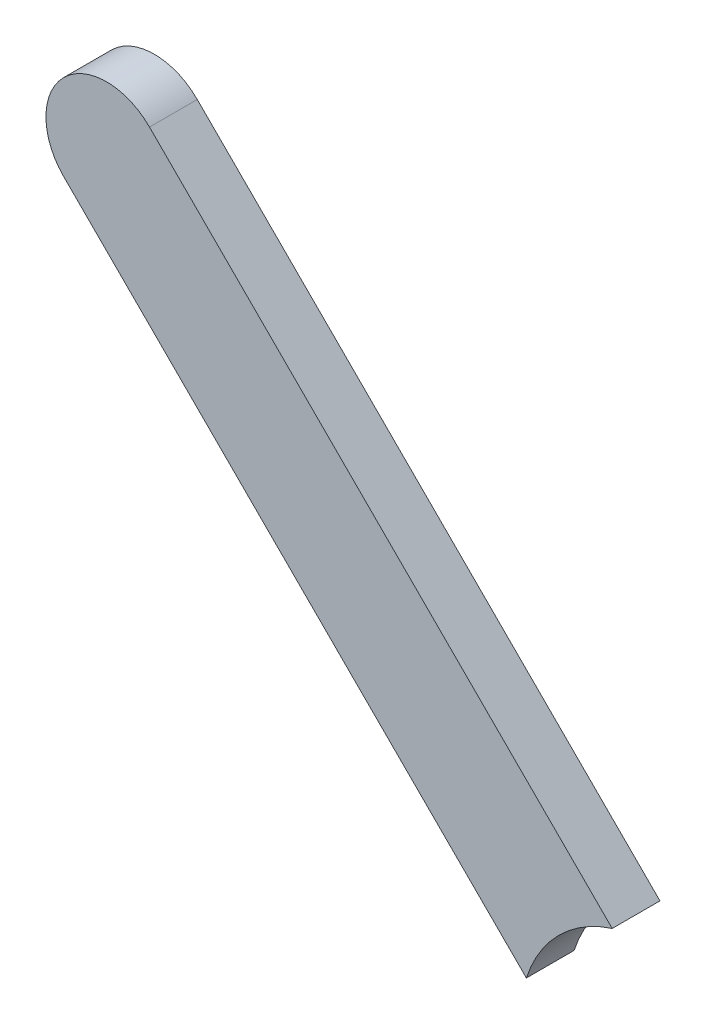
ISO-10303-21;
HEADER;
FILE_DESCRIPTION(('STEP AP214'),'2;1');
FILE_NAME('part.step','',(''),(''),'','','');
FILE_SCHEMA(('AUTOMOTIVE_DESIGN { 1 0 10303 214 1 1 1 1 }'));
ENDSEC;
DATA;
#1=APPLICATION_CONTEXT('core data for automotive mechanical design processes');
#2=APPLICATION_PROTOCOL_DEFINITION('international standard','automotive_design',2000,#1);
#3=PRODUCT_CONTEXT('',#1,'mechanical');
#4=PRODUCT('Part','Part','',(#3));
#5=PRODUCT_RELATED_PRODUCT_CATEGORY('part','',(#4));
#6=PRODUCT_DEFINITION_FORMATION('','',#4);
#7=PRODUCT_DEFINITION_CONTEXT('part definition',#1,'design');
#8=PRODUCT_DEFINITION('design','',#6,#7);
#9=PRODUCT_DEFINITION_SHAPE('','',#8);
#10=(LENGTH_UNIT() NAMED_UNIT(*) SI_UNIT(.MILLI.,.METRE.));
#11=(NAMED_UNIT(*) PLANE_ANGLE_UNIT() SI_UNIT($,.RADIAN.));
#12=(NAMED_UNIT(*) SI_UNIT($,.STERADIAN.) SOLID_ANGLE_UNIT());
#13=UNCERTAINTY_MEASURE_WITH_UNIT(LENGTH_MEASURE(1.E-05),#10,'distance_accuracy_value','');
#14=(GEOMETRIC_REPRESENTATION_CONTEXT(3) GLOBAL_UNCERTAINTY_ASSIGNED_CONTEXT((#13)) GLOBAL_UNIT_ASSIGNED_CONTEXT((#10,
#11,#12)) REPRESENTATION_CONTEXT('',''));
#15=CARTESIAN_POINT('',(0.,0.,0.));
#16=DIRECTION('',(0.,0.,1.));
#17=DIRECTION('',(1.,0.,0.));
#18=AXIS2_PLACEMENT_3D('',#15,#16,#17);
#19=CARTESIAN_POINT('',(91.38739406,87.95539686,0.));
#20=DIRECTION('',(0.707106781186548,0.707106781186548,0.));
#21=DIRECTION('',(0.707106781186548,-0.707106781186548,0.));
#22=AXIS2_PLACEMENT_3D('',#19,#20,#21);
#23=PLANE('',#22);
#24=DIRECTION('',(0.707106781186548,-0.707106781186548,0.));
#25=VECTOR('',#24,1.);
#26=CARTESIAN_POINT('',(91.38739406,87.95539686,0.1999996));
#27=LINE('',#26,#25);
#28=CARTESIAN_POINT('',(91.38739406,87.95539686,0.1999996));
#29=VERTEX_POINT('',#28);
#30=CARTESIAN_POINT('',(93.3244609788559,86.0183299411441,0.1999996));
#31=VERTEX_POINT('',#30);
#32=EDGE_CURVE('E11',#29,#31,#27,.T.);
#33=ORIENTED_EDGE('',*,*,#32,.F.);
#34=DIRECTION('',(0.,0.,1.));
#35=VECTOR('',#34,1.);
#36=CARTESIAN_POINT('',(91.38739406,87.95539686,0.));
#37=LINE('',#36,#35);
#38=CARTESIAN_POINT('',(91.38739406,87.95539686,0.));
#39=VERTEX_POINT('',#38);
#40=EDGE_CURVE('E24',#39,#29,#37,.T.);
#41=ORIENTED_EDGE('',*,*,#40,.F.);
#42=DIRECTION('',(0.707106781186548,-0.707106781186548,0.));
#43=VECTOR('',#42,1.);
#44=CARTESIAN_POINT('',(91.38739406,87.95539686,0.));
#45=LINE('',#44,#43);
#46=CARTESIAN_POINT('',(93.3244609788559,86.0183299411441,0.));
#47=VERTEX_POINT('',#46);
#48=EDGE_CURVE('E75',#39,#47,#45,.T.);
#49=ORIENTED_EDGE('',*,*,#48,.T.);
#50=DIRECTION('',(0.,0.,1.));
#51=VECTOR('',#50,1.);
#52=CARTESIAN_POINT('',(93.3244609788559,86.0183299411441,0.));
#53=LINE('',#52,#51);
#54=EDGE_CURVE('E37',#47,#31,#53,.T.);
#55=ORIENTED_EDGE('',*,*,#54,.T.);
#56=EDGE_LOOP('',(#33,#41,#49,#55));
#57=FACE_BOUND('',#56,.T.);
#58=ADVANCED_FACE('F17',(#57),#23,.F.);
#59=CARTESIAN_POINT('',(93.853,85.8490028,0.));
#60=DIRECTION('',(0.,0.,-1.));
#61=DIRECTION('',(1.,0.,0.));
#62=AXIS2_PLACEMENT_3D('',#59,#60,#61);
#63=CYLINDRICAL_SURFACE('',#62,0.55500016);
#64=DIRECTION('',(0.,0.,1.));
#65=VECTOR('',#64,1.);
#66=CARTESIAN_POINT('',(93.6836728588559,86.3775418211441,0.));
#67=LINE('',#66,#65);
#68=CARTESIAN_POINT('',(93.6836728588559,86.3775418211441,0.));
#69=VERTEX_POINT('',#68);
#70=CARTESIAN_POINT('',(93.6836728588559,86.3775418211441,0.1999996));
#71=VERTEX_POINT('',#70);
#72=EDGE_CURVE('E67',#69,#71,#67,.T.);
#73=ORIENTED_EDGE('',*,*,#72,.T.);
#74=CARTESIAN_POINT('',(93.853,85.8490028,0.1999996));
#75=DIRECTION('',(0.,0.,1.));
#76=DIRECTION('',(1.,0.,0.));
#77=AXIS2_PLACEMENT_3D('',#74,#75,#76);
#78=CIRCLE('',#77,0.55500016);
#79=EDGE_CURVE('E82',#71,#31,#78,.T.);
#80=ORIENTED_EDGE('',*,*,#79,.T.);
#81=ORIENTED_EDGE('',*,*,#54,.F.);
#82=CARTESIAN_POINT('',(93.853,85.8490028,0.));
#83=DIRECTION('',(0.,0.,1.));
#84=DIRECTION('',(1.,0.,0.));
#85=AXIS2_PLACEMENT_3D('',#82,#83,#84);
#86=CIRCLE('',#85,0.55500016);
#87=EDGE_CURVE('E80',#69,#47,#86,.T.);
#88=ORIENTED_EDGE('',*,*,#87,.F.);
#89=EDGE_LOOP('',(#73,#80,#81,#88));
#90=FACE_BOUND('',#89,.T.);
#91=ADVANCED_FACE('F88',(#90),#63,.F.);
#92=CARTESIAN_POINT('',(93.6836728588559,86.3775418211441,0.));
#93=DIRECTION('',(-0.707106781186548,-0.707106781186548,0.));
#94=DIRECTION('',(-0.707106781186548,0.707106781186548,0.));
#95=AXIS2_PLACEMENT_3D('',#92,#93,#94);
#96=PLANE('',#95);
#97=DIRECTION('',(-0.707106781186548,0.707106781186548,0.));
#98=VECTOR('',#97,1.);
#99=CARTESIAN_POINT('',(94.03260594,86.02860874,0.1999996));
#100=LINE('',#99,#98);
#101=CARTESIAN_POINT('',(91.74660594,88.31460874,0.1999996));
#102=VERTEX_POINT('',#101);
#103=EDGE_CURVE('E71',#71,#102,#100,.T.);
#104=ORIENTED_EDGE('',*,*,#103,.F.);
#105=ORIENTED_EDGE('',*,*,#72,.F.);
#106=DIRECTION('',(-0.707106781186548,0.707106781186548,0.));
#107=VECTOR('',#106,1.);
#108=CARTESIAN_POINT('',(94.03260594,86.02860874,0.));
#109=LINE('',#108,#107);
#110=CARTESIAN_POINT('',(91.74660594,88.31460874,0.));
#111=VERTEX_POINT('',#110);
#112=EDGE_CURVE('E63',#69,#111,#109,.T.);
#113=ORIENTED_EDGE('',*,*,#112,.T.);
#114=DIRECTION('',(0.,0.,1.));
#115=VECTOR('',#114,1.);
#116=CARTESIAN_POINT('',(91.74660594,88.31460874,0.));
#117=LINE('',#116,#115);
#118=EDGE_CURVE('E53',#111,#102,#117,.T.);
#119=ORIENTED_EDGE('',*,*,#118,.T.);
#120=EDGE_LOOP('',(#104,#105,#113,#119));
#121=FACE_BOUND('',#120,.T.);
#122=ADVANCED_FACE('F66',(#121),#96,.F.);
#123=CARTESIAN_POINT('',(91.567,88.1350028,0.));
#124=DIRECTION('',(0.,0.,-1.));
#125=DIRECTION('',(0.707106781186548,0.707106781186548,0.));
#126=AXIS2_PLACEMENT_3D('',#123,#124,#125);
#127=CYLINDRICAL_SURFACE('',#126,0.254001156230768);
#128=CARTESIAN_POINT('',(91.567,88.1350028,0.1999996));
#129=DIRECTION('',(0.,0.,1.));
#130=DIRECTION('',(0.707106781186548,0.707106781186548,0.));
#131=AXIS2_PLACEMENT_3D('',#128,#129,#130);
#132=CIRCLE('',#131,0.254001156230768);
#133=EDGE_CURVE('E59',#102,#29,#132,.T.);
#134=ORIENTED_EDGE('',*,*,#133,.F.);
#135=ORIENTED_EDGE('',*,*,#118,.F.);
#136=CARTESIAN_POINT('',(91.567,88.1350028,0.));
#137=DIRECTION('',(0.,0.,1.));
#138=DIRECTION('',(0.707106781186548,0.707106781186548,0.));
#139=AXIS2_PLACEMENT_3D('',#136,#137,#138);
#140=CIRCLE('',#139,0.254001156230768);
#141=EDGE_CURVE('E57',#111,#39,#140,.T.);
#142=ORIENTED_EDGE('',*,*,#141,.T.);
#143=ORIENTED_EDGE('',*,*,#40,.T.);
#144=EDGE_LOOP('',(#134,#135,#142,#143));
#145=FACE_BOUND('',#144,.T.);
#146=ADVANCED_FACE('F55',(#145),#127,.T.);
#147=CARTESIAN_POINT('',(91.38739406,87.95539686,0.));
#148=DIRECTION('',(0.,0.,-1.));
#149=DIRECTION('',(-1.,0.,0.));
#150=AXIS2_PLACEMENT_3D('',#147,#148,#149);
#151=PLANE('',#150);
#152=ORIENTED_EDGE('',*,*,#48,.F.);
#153=ORIENTED_EDGE('',*,*,#141,.F.);
#154=ORIENTED_EDGE('',*,*,#112,.F.);
#155=ORIENTED_EDGE('',*,*,#87,.T.);
#156=EDGE_LOOP('',(#152,#153,#154,#155));
#157=FACE_BOUND('',#156,.T.);
#158=ADVANCED_FACE('F74',(#157),#151,.T.);
#159=CARTESIAN_POINT('',(91.38739406,87.95539686,0.1999996));
#160=DIRECTION('',(0.,0.,-1.));
#161=DIRECTION('',(-1.,0.,0.));
#162=AXIS2_PLACEMENT_3D('',#159,#160,#161);
#163=PLANE('',#162);
#164=ORIENTED_EDGE('',*,*,#133,.T.);
#165=ORIENTED_EDGE('',*,*,#32,.T.);
#166=ORIENTED_EDGE('',*,*,#79,.F.);
#167=ORIENTED_EDGE('',*,*,#103,.T.);
#168=EDGE_LOOP('',(#164,#165,#166,#167));
#169=FACE_BOUND('',#168,.T.);
#170=ADVANCED_FACE('F91',(#169),#163,.F.);
#171=CLOSED_SHELL('',(#58,#91,#122,#146,#158,#170));
#172=MANIFOLD_SOLID_BREP('B1',#171);
#173=ADVANCED_BREP_SHAPE_REPRESENTATION('',(#18,#172),#14);
#174=SHAPE_DEFINITION_REPRESENTATION(#9,#173);
ENDSEC;
END-ISO-10303-21;
